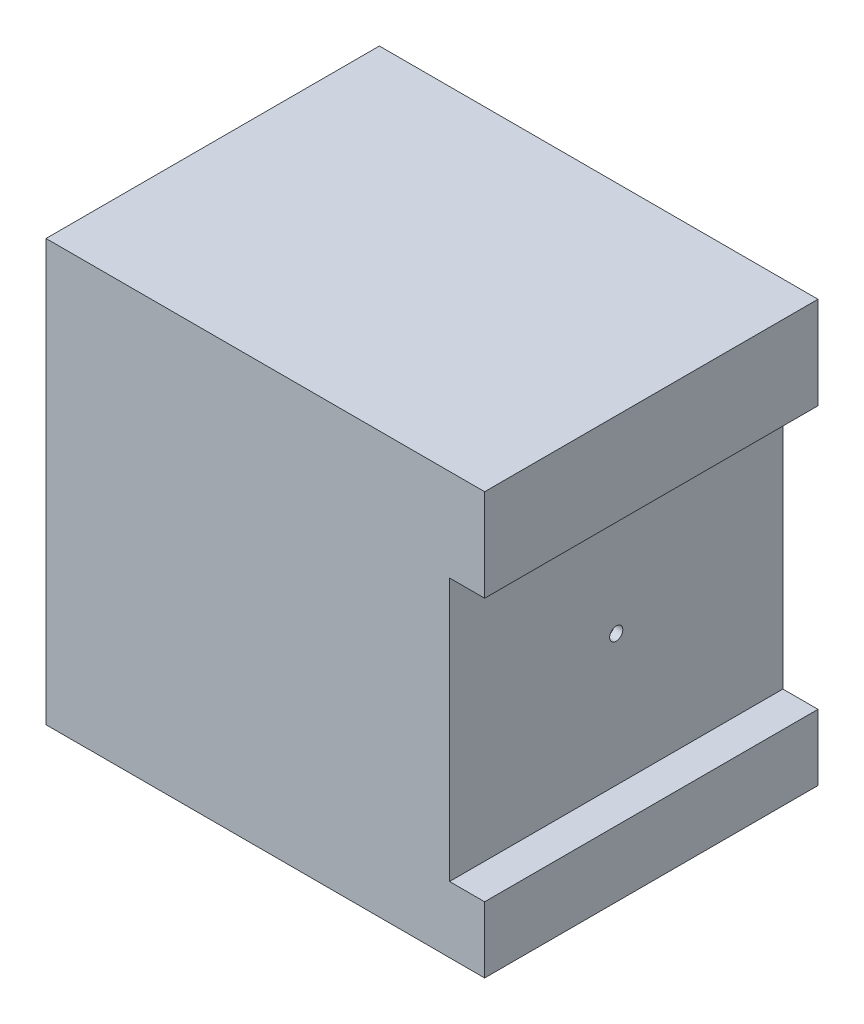
ISO-10303-21;
HEADER;
FILE_DESCRIPTION(('STEP AP214'),'2;1');
FILE_NAME('part.step','',(''),(''),'','','');
FILE_SCHEMA(('AUTOMOTIVE_DESIGN { 1 0 10303 214 1 1 1 1 }'));
ENDSEC;
DATA;
#1=APPLICATION_CONTEXT('core data for automotive mechanical design processes');
#2=APPLICATION_PROTOCOL_DEFINITION('international standard','automotive_design',2000,#1);
#3=PRODUCT_CONTEXT('',#1,'mechanical');
#4=PRODUCT('Part','Part','',(#3));
#5=PRODUCT_RELATED_PRODUCT_CATEGORY('part','',(#4));
#6=PRODUCT_DEFINITION_FORMATION('','',#4);
#7=PRODUCT_DEFINITION_CONTEXT('part definition',#1,'design');
#8=PRODUCT_DEFINITION('design','',#6,#7);
#9=PRODUCT_DEFINITION_SHAPE('','',#8);
#10=(LENGTH_UNIT() NAMED_UNIT(*) SI_UNIT(.MILLI.,.METRE.));
#11=(NAMED_UNIT(*) PLANE_ANGLE_UNIT() SI_UNIT($,.RADIAN.));
#12=(NAMED_UNIT(*) SI_UNIT($,.STERADIAN.) SOLID_ANGLE_UNIT());
#13=UNCERTAINTY_MEASURE_WITH_UNIT(LENGTH_MEASURE(1.E-05),#10,'distance_accuracy_value','');
#14=(GEOMETRIC_REPRESENTATION_CONTEXT(3) GLOBAL_UNCERTAINTY_ASSIGNED_CONTEXT((#13)) GLOBAL_UNIT_ASSIGNED_CONTEXT((#10,
#11,#12)) REPRESENTATION_CONTEXT('',''));
#15=CARTESIAN_POINT('',(0.,0.,0.));
#16=DIRECTION('',(0.,0.,1.));
#17=DIRECTION('',(1.,0.,0.));
#18=AXIS2_PLACEMENT_3D('',#15,#16,#17);
#19=CARTESIAN_POINT('',(25.,22.5,4.));
#20=DIRECTION('',(-1.,0.,0.));
#21=DIRECTION('',(0.,-1.,0.));
#22=AXIS2_PLACEMENT_3D('',#19,#20,#21);
#23=PLANE('',#22);
#24=DIRECTION('',(0.,1.,0.));
#25=VECTOR('',#24,1.);
#26=CARTESIAN_POINT('',(25.,22.5,-34.));
#27=LINE('',#26,#25);
#28=CARTESIAN_POINT('',(25.,-22.5073325220754,-34.));
#29=VERTEX_POINT('',#28);
#30=CARTESIAN_POINT('',(25.,-14.9821389756463,-34.));
#31=VERTEX_POINT('',#30);
#32=EDGE_CURVE('E237',#29,#31,#27,.T.);
#33=ORIENTED_EDGE('',*,*,#32,.T.);
#34=DIRECTION('',(0.,0.,-1.));
#35=VECTOR('',#34,1.);
#36=CARTESIAN_POINT('',(25.,-14.9821389756463,4.));
#37=LINE('',#36,#35);
#38=CARTESIAN_POINT('',(25.,-14.9821389756463,4.));
#39=VERTEX_POINT('',#38);
#40=EDGE_CURVE('E164',#39,#31,#37,.T.);
#41=ORIENTED_EDGE('',*,*,#40,.F.);
#42=DIRECTION('',(0.,1.,0.));
#43=VECTOR('',#42,1.);
#44=CARTESIAN_POINT('',(25.,22.5,4.));
#45=LINE('',#44,#43);
#46=CARTESIAN_POINT('',(25.,-22.5073325220754,4.));
#47=VERTEX_POINT('',#46);
#48=EDGE_CURVE('E265',#47,#39,#45,.T.);
#49=ORIENTED_EDGE('',*,*,#48,.F.);
#50=DIRECTION('',(0.,0.,-1.));
#51=VECTOR('',#50,1.);
#52=CARTESIAN_POINT('',(25.,-22.5073325220754,4.));
#53=LINE('',#52,#51);
#54=EDGE_CURVE('E232',#47,#29,#53,.T.);
#55=ORIENTED_EDGE('',*,*,#54,.T.);
#56=EDGE_LOOP('',(#33,#41,#49,#55));
#57=FACE_BOUND('',#56,.T.);
#58=ADVANCED_FACE('F43',(#57),#23,.F.);
#59=CARTESIAN_POINT('',(-25.,-22.5,4.));
#60=DIRECTION('',(0.,1.,0.));
#61=DIRECTION('',(0.,0.,1.));
#62=AXIS2_PLACEMENT_3D('',#59,#60,#61);
#63=PLANE('',#62);
#64=DIRECTION('',(1.,0.,0.));
#65=VECTOR('',#64,1.);
#66=CARTESIAN_POINT('',(-25.,-22.5,4.));
#67=LINE('',#66,#65);
#68=CARTESIAN_POINT('',(-20.,-22.5,4.));
#69=VERTEX_POINT('',#68);
#70=CARTESIAN_POINT('',(20.,-22.5,4.));
#71=VERTEX_POINT('',#70);
#72=EDGE_CURVE('E273',#69,#71,#67,.T.);
#73=ORIENTED_EDGE('',*,*,#72,.F.);
#74=DIRECTION('',(0.,0.,-1.));
#75=VECTOR('',#74,1.);
#76=CARTESIAN_POINT('',(-20.,-22.5,4.));
#77=LINE('',#76,#75);
#78=CARTESIAN_POINT('',(-20.,-22.5,0.));
#79=VERTEX_POINT('',#78);
#80=EDGE_CURVE('E207',#69,#79,#77,.T.);
#81=ORIENTED_EDGE('',*,*,#80,.T.);
#82=DIRECTION('',(1.,0.,0.));
#83=VECTOR('',#82,1.);
#84=CARTESIAN_POINT('',(-25.,-22.5,0.));
#85=LINE('',#84,#83);
#86=CARTESIAN_POINT('',(20.,-22.5,0.));
#87=VERTEX_POINT('',#86);
#88=EDGE_CURVE('E68',#79,#87,#85,.T.);
#89=ORIENTED_EDGE('',*,*,#88,.T.);
#90=DIRECTION('',(0.,0.,-1.));
#91=VECTOR('',#90,1.);
#92=CARTESIAN_POINT('',(20.,-22.5,4.));
#93=LINE('',#92,#91);
#94=EDGE_CURVE('E258',#71,#87,#93,.T.);
#95=ORIENTED_EDGE('',*,*,#94,.F.);
#96=EDGE_LOOP('',(#73,#81,#89,#95));
#97=FACE_BOUND('',#96,.T.);
#98=ADVANCED_FACE('F306',(#97),#63,.F.);
#99=CARTESIAN_POINT('',(0.,0.,0.));
#100=DIRECTION('',(0.,0.,1.));
#101=DIRECTION('',(1.,0.,0.));
#102=AXIS2_PLACEMENT_3D('',#99,#100,#101);
#103=PLANE('',#102);
#104=ORIENTED_EDGE('',*,*,#88,.F.);
#105=DIRECTION('',(0.,1.,0.));
#106=VECTOR('',#105,1.);
#107=CARTESIAN_POINT('',(-20.,0.,0.));
#108=LINE('',#107,#106);
#109=CARTESIAN_POINT('',(-20.,22.5,0.));
#110=VERTEX_POINT('',#109);
#111=EDGE_CURVE('E200',#79,#110,#108,.T.);
#112=ORIENTED_EDGE('',*,*,#111,.T.);
#113=DIRECTION('',(-1.,0.,0.));
#114=VECTOR('',#113,1.);
#115=CARTESIAN_POINT('',(-25.,22.5,0.));
#116=LINE('',#115,#114);
#117=CARTESIAN_POINT('',(20.,22.5,0.));
#118=VERTEX_POINT('',#117);
#119=EDGE_CURVE('E264',#118,#110,#116,.T.);
#120=ORIENTED_EDGE('',*,*,#119,.F.);
#121=DIRECTION('',(0.,1.,0.));
#122=VECTOR('',#121,1.);
#123=CARTESIAN_POINT('',(20.,0.,0.));
#124=LINE('',#123,#122);
#125=EDGE_CURVE('E53',#87,#118,#124,.T.);
#126=ORIENTED_EDGE('',*,*,#125,.F.);
#127=EDGE_LOOP('',(#104,#112,#120,#126));
#128=FACE_BOUND('',#127,.T.);
#129=ADVANCED_FACE('F291',(#128),#103,.F.);
#130=CARTESIAN_POINT('',(25.,14.9821389756463,4.));
#131=VERTEX_POINT('',#130);
#132=CARTESIAN_POINT('',(25.,25.5,4.));
#133=VERTEX_POINT('',#132);
#134=EDGE_CURVE('E270',#131,#133,#45,.T.);
#135=ORIENTED_EDGE('',*,*,#134,.F.);
#136=DIRECTION('',(0.,0.,1.));
#137=VECTOR('',#136,1.);
#138=CARTESIAN_POINT('',(25.,14.9821389756463,4.));
#139=LINE('',#138,#137);
#140=CARTESIAN_POINT('',(25.,14.9821389756463,-34.));
#141=VERTEX_POINT('',#140);
#142=EDGE_CURVE('E324',#141,#131,#139,.T.);
#143=ORIENTED_EDGE('',*,*,#142,.F.);
#144=CARTESIAN_POINT('',(25.,25.5,-34.));
#145=VERTEX_POINT('',#144);
#146=EDGE_CURVE('E169',#141,#145,#27,.T.);
#147=ORIENTED_EDGE('',*,*,#146,.T.);
#148=DIRECTION('',(0.,0.,-1.));
#149=VECTOR('',#148,1.);
#150=CARTESIAN_POINT('',(25.,25.5,-34.));
#151=LINE('',#150,#149);
#152=EDGE_CURVE('E211',#133,#145,#151,.T.);
#153=ORIENTED_EDGE('',*,*,#152,.F.);
#154=EDGE_LOOP('',(#135,#143,#147,#153));
#155=FACE_BOUND('',#154,.T.);
#156=ADVANCED_FACE('F45',(#155),#23,.F.);
#157=CARTESIAN_POINT('',(-25.,22.5,4.));
#158=DIRECTION('',(1.,0.,0.));
#159=DIRECTION('',(0.,1.,0.));
#160=AXIS2_PLACEMENT_3D('',#157,#158,#159);
#161=PLANE('',#160);
#162=CARTESIAN_POINT('',(-25.,0.,-15.));
#163=DIRECTION('',(-1.,0.,0.));
#164=DIRECTION('',(0.,-1.,0.));
#165=AXIS2_PLACEMENT_3D('',#162,#163,#164);
#166=CIRCLE('',#165,0.75);
#167=CARTESIAN_POINT('',(-25.,-0.750000000000004,-15.));
#168=VERTEX_POINT('',#167);
#169=EDGE_CURVE('E346',#168,#168,#166,.T.);
#170=ORIENTED_EDGE('',*,*,#169,.F.);
#171=EDGE_LOOP('',(#170));
#172=FACE_BOUND('',#171,.T.);
#173=DIRECTION('',(0.,0.,1.));
#174=VECTOR('',#173,1.);
#175=CARTESIAN_POINT('',(-25.,-22.5073325220754,4.));
#176=LINE('',#175,#174);
#177=CARTESIAN_POINT('',(-25.,-22.5073325220754,-34.));
#178=VERTEX_POINT('',#177);
#179=CARTESIAN_POINT('',(-25.,-22.5073325220754,4.));
#180=VERTEX_POINT('',#179);
#181=EDGE_CURVE('E184',#178,#180,#176,.T.);
#182=ORIENTED_EDGE('',*,*,#181,.T.);
#183=DIRECTION('',(0.,-1.,0.));
#184=VECTOR('',#183,1.);
#185=CARTESIAN_POINT('',(-25.,22.5,4.));
#186=LINE('',#185,#184);
#187=CARTESIAN_POINT('',(-25.,25.5,4.));
#188=VERTEX_POINT('',#187);
#189=EDGE_CURVE('E269',#188,#180,#186,.T.);
#190=ORIENTED_EDGE('',*,*,#189,.F.);
#191=DIRECTION('',(0.,0.,1.));
#192=VECTOR('',#191,1.);
#193=CARTESIAN_POINT('',(-25.,25.5,-34.));
#194=LINE('',#193,#192);
#195=CARTESIAN_POINT('',(-25.,25.5,-34.));
#196=VERTEX_POINT('',#195);
#197=EDGE_CURVE('E218',#196,#188,#194,.T.);
#198=ORIENTED_EDGE('',*,*,#197,.F.);
#199=DIRECTION('',(0.,-1.,0.));
#200=VECTOR('',#199,1.);
#201=CARTESIAN_POINT('',(-25.,25.5,-34.));
#202=LINE('',#201,#200);
#203=EDGE_CURVE('E226',#196,#178,#202,.T.);
#204=ORIENTED_EDGE('',*,*,#203,.T.);
#205=EDGE_LOOP('',(#182,#190,#198,#204));
#206=FACE_BOUND('',#205,.T.);
#207=ADVANCED_FACE('F316',(#172,#206),#161,.F.);
#208=CARTESIAN_POINT('',(0.,0.,4.));
#209=DIRECTION('',(0.,0.,1.));
#210=DIRECTION('',(1.,0.,0.));
#211=AXIS2_PLACEMENT_3D('',#208,#209,#210);
#212=PLANE('',#211);
#213=DIRECTION('',(1.,0.,0.));
#214=VECTOR('',#213,1.);
#215=CARTESIAN_POINT('',(21.,-14.9821389756463,4.));
#216=LINE('',#215,#214);
#217=CARTESIAN_POINT('',(21.,-14.9821389756463,4.));
#218=VERTEX_POINT('',#217);
#219=EDGE_CURVE('E174',#218,#39,#216,.T.);
#220=ORIENTED_EDGE('',*,*,#219,.F.);
#221=DIRECTION('',(0.,-1.,0.));
#222=VECTOR('',#221,1.);
#223=CARTESIAN_POINT('',(21.,14.9821389756463,4.));
#224=LINE('',#223,#222);
#225=CARTESIAN_POINT('',(21.,14.9821389756463,4.));
#226=VERTEX_POINT('',#225);
#227=EDGE_CURVE('E156',#226,#218,#224,.T.);
#228=ORIENTED_EDGE('',*,*,#227,.F.);
#229=DIRECTION('',(1.,0.,0.));
#230=VECTOR('',#229,1.);
#231=CARTESIAN_POINT('',(21.,14.9821389756463,4.));
#232=LINE('',#231,#230);
#233=EDGE_CURVE('E153',#226,#131,#232,.T.);
#234=ORIENTED_EDGE('',*,*,#233,.T.);
#235=ORIENTED_EDGE('',*,*,#134,.T.);
#236=DIRECTION('',(1.,0.,0.));
#237=VECTOR('',#236,1.);
#238=CARTESIAN_POINT('',(25.,25.5,4.));
#239=LINE('',#238,#237);
#240=EDGE_CURVE('E222',#188,#133,#239,.T.);
#241=ORIENTED_EDGE('',*,*,#240,.F.);
#242=ORIENTED_EDGE('',*,*,#189,.T.);
#243=DIRECTION('',(-1.,0.,0.));
#244=VECTOR('',#243,1.);
#245=CARTESIAN_POINT('',(-20.,-22.5073325220754,4.));
#246=LINE('',#245,#244);
#247=CARTESIAN_POINT('',(-20.,-22.5073325220754,4.));
#248=VERTEX_POINT('',#247);
#249=EDGE_CURVE('E196',#248,#180,#246,.T.);
#250=ORIENTED_EDGE('',*,*,#249,.F.);
#251=DIRECTION('',(0.,1.,0.));
#252=VECTOR('',#251,1.);
#253=CARTESIAN_POINT('',(-20.,25.5,4.));
#254=LINE('',#253,#252);
#255=EDGE_CURVE('E179',#248,#69,#254,.T.);
#256=ORIENTED_EDGE('',*,*,#255,.T.);
#257=ORIENTED_EDGE('',*,*,#72,.T.);
#258=DIRECTION('',(0.,-1.,0.));
#259=VECTOR('',#258,1.);
#260=CARTESIAN_POINT('',(20.,22.5,4.));
#261=LINE('',#260,#259);
#262=CARTESIAN_POINT('',(20.,-22.5073325220754,4.));
#263=VERTEX_POINT('',#262);
#264=EDGE_CURVE('E233',#71,#263,#261,.T.);
#265=ORIENTED_EDGE('',*,*,#264,.T.);
#266=DIRECTION('',(1.,0.,0.));
#267=VECTOR('',#266,1.);
#268=CARTESIAN_POINT('',(20.,-22.5073325220754,4.));
#269=LINE('',#268,#267);
#270=EDGE_CURVE('E248',#263,#47,#269,.T.);
#271=ORIENTED_EDGE('',*,*,#270,.T.);
#272=ORIENTED_EDGE('',*,*,#48,.T.);
#273=EDGE_LOOP('',(#220,#228,#234,#235,#241,#242,#250,#256,#257,#265,#271,#272));
#274=FACE_BOUND('',#273,.T.);
#275=ADVANCED_FACE('F304',(#274),#212,.T.);
#276=CARTESIAN_POINT('',(20.,0.,0.));
#277=DIRECTION('',(1.,0.,0.));
#278=DIRECTION('',(0.,1.,0.));
#279=AXIS2_PLACEMENT_3D('',#276,#277,#278);
#280=PLANE('',#279);
#281=CARTESIAN_POINT('',(20.,0.,-15.));
#282=DIRECTION('',(1.,0.,0.));
#283=DIRECTION('',(0.,1.,0.));
#284=AXIS2_PLACEMENT_3D('',#281,#282,#283);
#285=CIRCLE('',#284,0.75);
#286=CARTESIAN_POINT('',(20.,0.750000000000003,-15.));
#287=VERTEX_POINT('',#286);
#288=EDGE_CURVE('E335',#287,#287,#285,.T.);
#289=ORIENTED_EDGE('',*,*,#288,.T.);
#290=EDGE_LOOP('',(#289));
#291=FACE_BOUND('',#290,.T.);
#292=ORIENTED_EDGE('',*,*,#264,.F.);
#293=ORIENTED_EDGE('',*,*,#94,.T.);
#294=ORIENTED_EDGE('',*,*,#125,.T.);
#295=DIRECTION('',(0.,0.,1.));
#296=VECTOR('',#295,1.);
#297=CARTESIAN_POINT('',(20.,22.5,4.));
#298=LINE('',#297,#296);
#299=CARTESIAN_POINT('',(20.,22.5,-34.));
#300=VERTEX_POINT('',#299);
#301=EDGE_CURVE('E244',#300,#118,#298,.T.);
#302=ORIENTED_EDGE('',*,*,#301,.F.);
#303=DIRECTION('',(0.,1.,0.));
#304=VECTOR('',#303,1.);
#305=CARTESIAN_POINT('',(20.,22.5,-34.));
#306=LINE('',#305,#304);
#307=CARTESIAN_POINT('',(20.,-22.5073325220754,-34.));
#308=VERTEX_POINT('',#307);
#309=EDGE_CURVE('E241',#308,#300,#306,.T.);
#310=ORIENTED_EDGE('',*,*,#309,.F.);
#311=DIRECTION('',(0.,0.,-1.));
#312=VECTOR('',#311,1.);
#313=CARTESIAN_POINT('',(20.,-22.5073325220754,4.));
#314=LINE('',#313,#312);
#315=EDGE_CURVE('E236',#263,#308,#314,.T.);
#316=ORIENTED_EDGE('',*,*,#315,.F.);
#317=EDGE_LOOP('',(#292,#293,#294,#302,#310,#316));
#318=FACE_BOUND('',#317,.T.);
#319=ADVANCED_FACE('F287',(#291,#318),#280,.F.);
#320=CARTESIAN_POINT('',(20.,22.5,-34.));
#321=DIRECTION('',(0.,0.,-1.));
#322=DIRECTION('',(0.,1.,0.));
#323=AXIS2_PLACEMENT_3D('',#320,#321,#322);
#324=PLANE('',#323);
#325=DIRECTION('',(1.,0.,0.));
#326=VECTOR('',#325,1.);
#327=CARTESIAN_POINT('',(21.,-14.9821389756463,-34.));
#328=LINE('',#327,#326);
#329=CARTESIAN_POINT('',(21.,-14.9821389756463,-34.));
#330=VERTEX_POINT('',#329);
#331=EDGE_CURVE('E195',#330,#31,#328,.T.);
#332=ORIENTED_EDGE('',*,*,#331,.T.);
#333=ORIENTED_EDGE('',*,*,#32,.F.);
#334=DIRECTION('',(1.,0.,0.));
#335=VECTOR('',#334,1.);
#336=CARTESIAN_POINT('',(20.,-22.5073325220754,-34.));
#337=LINE('',#336,#335);
#338=EDGE_CURVE('E255',#308,#29,#337,.T.);
#339=ORIENTED_EDGE('',*,*,#338,.F.);
#340=ORIENTED_EDGE('',*,*,#309,.T.);
#341=DIRECTION('',(-1.,0.,0.));
#342=VECTOR('',#341,1.);
#343=CARTESIAN_POINT('',(25.,22.5,-34.));
#344=LINE('',#343,#342);
#345=CARTESIAN_POINT('',(-20.,22.5,-34.));
#346=VERTEX_POINT('',#345);
#347=EDGE_CURVE('E210',#300,#346,#344,.T.);
#348=ORIENTED_EDGE('',*,*,#347,.T.);
#349=DIRECTION('',(0.,-1.,0.));
#350=VECTOR('',#349,1.);
#351=CARTESIAN_POINT('',(-20.,25.5,-34.));
#352=LINE('',#351,#350);
#353=CARTESIAN_POINT('',(-20.,-22.5073325220754,-34.));
#354=VERTEX_POINT('',#353);
#355=EDGE_CURVE('E183',#346,#354,#352,.T.);
#356=ORIENTED_EDGE('',*,*,#355,.T.);
#357=DIRECTION('',(-1.,0.,0.));
#358=VECTOR('',#357,1.);
#359=CARTESIAN_POINT('',(-20.,-22.5073325220754,-34.));
#360=LINE('',#359,#358);
#361=EDGE_CURVE('E191',#354,#178,#360,.T.);
#362=ORIENTED_EDGE('',*,*,#361,.T.);
#363=ORIENTED_EDGE('',*,*,#203,.F.);
#364=DIRECTION('',(-1.,0.,0.));
#365=VECTOR('',#364,1.);
#366=CARTESIAN_POINT('',(25.,25.5,-34.));
#367=LINE('',#366,#365);
#368=EDGE_CURVE('E215',#145,#196,#367,.T.);
#369=ORIENTED_EDGE('',*,*,#368,.F.);
#370=ORIENTED_EDGE('',*,*,#146,.F.);
#371=DIRECTION('',(1.,0.,0.));
#372=VECTOR('',#371,1.);
#373=CARTESIAN_POINT('',(21.,14.9821389756463,-34.));
#374=LINE('',#373,#372);
#375=CARTESIAN_POINT('',(21.,14.9821389756463,-34.));
#376=VERTEX_POINT('',#375);
#377=EDGE_CURVE('E150',#376,#141,#374,.T.);
#378=ORIENTED_EDGE('',*,*,#377,.F.);
#379=DIRECTION('',(0.,1.,0.));
#380=VECTOR('',#379,1.);
#381=CARTESIAN_POINT('',(21.,14.9821389756463,-34.));
#382=LINE('',#381,#380);
#383=EDGE_CURVE('E157',#330,#376,#382,.T.);
#384=ORIENTED_EDGE('',*,*,#383,.F.);
#385=EDGE_LOOP('',(#332,#333,#339,#340,#348,#356,#362,#363,#369,#370,#378,#384));
#386=FACE_BOUND('',#385,.T.);
#387=ADVANCED_FACE('F167',(#386),#324,.T.);
#388=CARTESIAN_POINT('',(20.,-22.5073325220754,4.));
#389=DIRECTION('',(0.,-1.,0.));
#390=DIRECTION('',(1.,0.,0.));
#391=AXIS2_PLACEMENT_3D('',#388,#389,#390);
#392=PLANE('',#391);
#393=ORIENTED_EDGE('',*,*,#54,.F.);
#394=ORIENTED_EDGE('',*,*,#270,.F.);
#395=ORIENTED_EDGE('',*,*,#315,.T.);
#396=ORIENTED_EDGE('',*,*,#338,.T.);
#397=EDGE_LOOP('',(#393,#394,#395,#396));
#398=FACE_BOUND('',#397,.T.);
#399=ADVANCED_FACE('F301',(#398),#392,.T.);
#400=CARTESIAN_POINT('',(0.,25.5,0.));
#401=DIRECTION('',(0.,-1.,0.));
#402=DIRECTION('',(0.,0.,-1.));
#403=AXIS2_PLACEMENT_3D('',#400,#401,#402);
#404=PLANE('',#403);
#405=ORIENTED_EDGE('',*,*,#368,.T.);
#406=ORIENTED_EDGE('',*,*,#197,.T.);
#407=ORIENTED_EDGE('',*,*,#240,.T.);
#408=ORIENTED_EDGE('',*,*,#152,.T.);
#409=EDGE_LOOP('',(#405,#406,#407,#408));
#410=FACE_BOUND('',#409,.T.);
#411=ADVANCED_FACE('F321',(#410),#404,.F.);
#412=CARTESIAN_POINT('',(0.,22.5,0.));
#413=DIRECTION('',(0.,-1.,0.));
#414=DIRECTION('',(0.,0.,-1.));
#415=AXIS2_PLACEMENT_3D('',#412,#413,#414);
#416=PLANE('',#415);
#417=DIRECTION('',(0.,0.,1.));
#418=VECTOR('',#417,1.);
#419=CARTESIAN_POINT('',(-20.,22.5,0.));
#420=LINE('',#419,#418);
#421=EDGE_CURVE('E11',#346,#110,#420,.T.);
#422=ORIENTED_EDGE('',*,*,#421,.F.);
#423=ORIENTED_EDGE('',*,*,#347,.F.);
#424=ORIENTED_EDGE('',*,*,#301,.T.);
#425=ORIENTED_EDGE('',*,*,#119,.T.);
#426=EDGE_LOOP('',(#422,#423,#424,#425));
#427=FACE_BOUND('',#426,.T.);
#428=ADVANCED_FACE('F294',(#427),#416,.T.);
#429=CARTESIAN_POINT('',(-20.,0.,0.));
#430=DIRECTION('',(1.,0.,0.));
#431=DIRECTION('',(0.,1.,0.));
#432=AXIS2_PLACEMENT_3D('',#429,#430,#431);
#433=PLANE('',#432);
#434=CARTESIAN_POINT('',(-20.,0.,-15.));
#435=DIRECTION('',(1.,0.,0.));
#436=DIRECTION('',(0.,1.,0.));
#437=AXIS2_PLACEMENT_3D('',#434,#435,#436);
#438=CIRCLE('',#437,0.75);
#439=CARTESIAN_POINT('',(-20.,0.749999999999997,-15.));
#440=VERTEX_POINT('',#439);
#441=EDGE_CURVE('E342',#440,#440,#438,.T.);
#442=ORIENTED_EDGE('',*,*,#441,.F.);
#443=EDGE_LOOP('',(#442));
#444=FACE_BOUND('',#443,.T.);
#445=ORIENTED_EDGE('',*,*,#80,.F.);
#446=ORIENTED_EDGE('',*,*,#255,.F.);
#447=DIRECTION('',(0.,0.,1.));
#448=VECTOR('',#447,1.);
#449=CARTESIAN_POINT('',(-20.,-22.5073325220754,4.));
#450=LINE('',#449,#448);
#451=EDGE_CURVE('E187',#354,#248,#450,.T.);
#452=ORIENTED_EDGE('',*,*,#451,.F.);
#453=ORIENTED_EDGE('',*,*,#355,.F.);
#454=ORIENTED_EDGE('',*,*,#421,.T.);
#455=ORIENTED_EDGE('',*,*,#111,.F.);
#456=EDGE_LOOP('',(#445,#446,#452,#453,#454,#455));
#457=FACE_BOUND('',#456,.T.);
#458=ADVANCED_FACE('F309',(#444,#457),#433,.T.);
#459=CARTESIAN_POINT('',(-20.,-22.5073325220754,4.));
#460=DIRECTION('',(0.,-1.,0.));
#461=DIRECTION('',(1.,0.,0.));
#462=AXIS2_PLACEMENT_3D('',#459,#460,#461);
#463=PLANE('',#462);
#464=ORIENTED_EDGE('',*,*,#181,.F.);
#465=ORIENTED_EDGE('',*,*,#361,.F.);
#466=ORIENTED_EDGE('',*,*,#451,.T.);
#467=ORIENTED_EDGE('',*,*,#249,.T.);
#468=EDGE_LOOP('',(#464,#465,#466,#467));
#469=FACE_BOUND('',#468,.T.);
#470=ADVANCED_FACE('F314',(#469),#463,.T.);
#471=CARTESIAN_POINT('',(21.,-14.9821389756463,4.));
#472=DIRECTION('',(0.,-1.,0.));
#473=DIRECTION('',(1.,0.,0.));
#474=AXIS2_PLACEMENT_3D('',#471,#472,#473);
#475=PLANE('',#474);
#476=ORIENTED_EDGE('',*,*,#40,.T.);
#477=ORIENTED_EDGE('',*,*,#331,.F.);
#478=DIRECTION('',(0.,0.,-1.));
#479=VECTOR('',#478,1.);
#480=CARTESIAN_POINT('',(21.,-14.9821389756463,4.));
#481=LINE('',#480,#479);
#482=EDGE_CURVE('E60',#218,#330,#481,.T.);
#483=ORIENTED_EDGE('',*,*,#482,.F.);
#484=ORIENTED_EDGE('',*,*,#219,.T.);
#485=EDGE_LOOP('',(#476,#477,#483,#484));
#486=FACE_BOUND('',#485,.T.);
#487=ADVANCED_FACE('F366',(#486),#475,.F.);
#488=CARTESIAN_POINT('',(21.,14.9821389756463,4.));
#489=DIRECTION('',(0.,1.,0.));
#490=DIRECTION('',(-1.,0.,0.));
#491=AXIS2_PLACEMENT_3D('',#488,#489,#490);
#492=PLANE('',#491);
#493=ORIENTED_EDGE('',*,*,#142,.T.);
#494=ORIENTED_EDGE('',*,*,#233,.F.);
#495=DIRECTION('',(0.,0.,1.));
#496=VECTOR('',#495,1.);
#497=CARTESIAN_POINT('',(21.,14.9821389756463,4.));
#498=LINE('',#497,#496);
#499=EDGE_CURVE('E147',#376,#226,#498,.T.);
#500=ORIENTED_EDGE('',*,*,#499,.F.);
#501=ORIENTED_EDGE('',*,*,#377,.T.);
#502=EDGE_LOOP('',(#493,#494,#500,#501));
#503=FACE_BOUND('',#502,.T.);
#504=ADVANCED_FACE('F148',(#503),#492,.F.);
#505=CARTESIAN_POINT('',(21.,0.,0.));
#506=DIRECTION('',(1.,0.,0.));
#507=DIRECTION('',(0.,1.,0.));
#508=AXIS2_PLACEMENT_3D('',#505,#506,#507);
#509=PLANE('',#508);
#510=CARTESIAN_POINT('',(21.,0.,-15.));
#511=DIRECTION('',(1.,0.,0.));
#512=DIRECTION('',(0.,1.,0.));
#513=AXIS2_PLACEMENT_3D('',#510,#511,#512);
#514=CIRCLE('',#513,0.75);
#515=CARTESIAN_POINT('',(21.,0.750000000000004,-15.));
#516=VERTEX_POINT('',#515);
#517=EDGE_CURVE('E47',#516,#516,#514,.T.);
#518=ORIENTED_EDGE('',*,*,#517,.F.);
#519=EDGE_LOOP('',(#518));
#520=FACE_BOUND('',#519,.T.);
#521=ORIENTED_EDGE('',*,*,#383,.T.);
#522=ORIENTED_EDGE('',*,*,#499,.T.);
#523=ORIENTED_EDGE('',*,*,#227,.T.);
#524=ORIENTED_EDGE('',*,*,#482,.T.);
#525=EDGE_LOOP('',(#521,#522,#523,#524));
#526=FACE_BOUND('',#525,.T.);
#527=ADVANCED_FACE('F160',(#520,#526),#509,.T.);
#528=CARTESIAN_POINT('',(29.,0.,-15.));
#529=DIRECTION('',(-1.,0.,0.));
#530=DIRECTION('',(0.,-1.,0.));
#531=AXIS2_PLACEMENT_3D('',#528,#529,#530);
#532=CYLINDRICAL_SURFACE('',#531,0.75);
#533=ORIENTED_EDGE('',*,*,#517,.T.);
#534=EDGE_LOOP('',(#533));
#535=FACE_BOUND('',#534,.T.);
#536=ORIENTED_EDGE('',*,*,#288,.F.);
#537=EDGE_LOOP('',(#536));
#538=FACE_BOUND('',#537,.T.);
#539=ADVANCED_FACE('F355',(#535,#538),#532,.F.);
#540=ORIENTED_EDGE('',*,*,#441,.T.);
#541=EDGE_LOOP('',(#540));
#542=FACE_BOUND('',#541,.T.);
#543=ORIENTED_EDGE('',*,*,#169,.T.);
#544=EDGE_LOOP('',(#543));
#545=FACE_BOUND('',#544,.T.);
#546=ADVANCED_FACE('F364',(#542,#545),#532,.F.);
#547=CLOSED_SHELL('',(#58,#98,#129,#156,#207,#275,#319,#387,#399,#411,#428,#458,#470,#487,#504,
#527,#539,#546));
#548=MANIFOLD_SOLID_BREP('B2',#547);
#549=ADVANCED_BREP_SHAPE_REPRESENTATION('',(#18,#548),#14);
#550=SHAPE_DEFINITION_REPRESENTATION(#9,#549);
ENDSEC;
END-ISO-10303-21;
